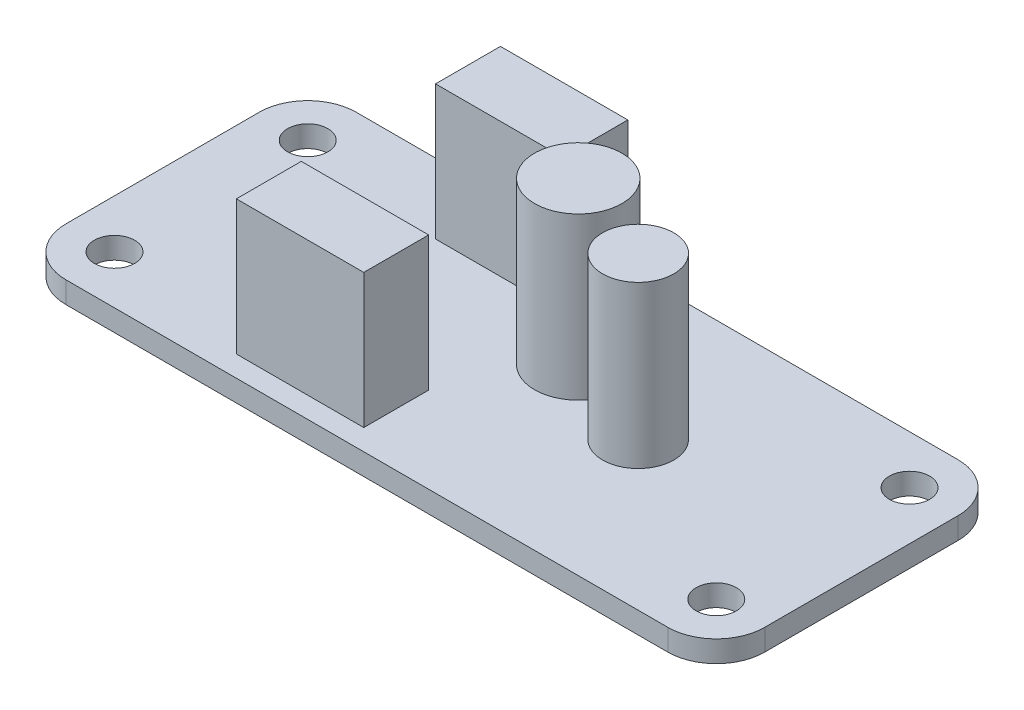
ISO-10303-21;
HEADER;
FILE_DESCRIPTION(('STEP AP214'),'2;1');
FILE_NAME('part.step','',(''),(''),'','','');
FILE_SCHEMA(('AUTOMOTIVE_DESIGN { 1 0 10303 214 1 1 1 1 }'));
ENDSEC;
DATA;
#1=APPLICATION_CONTEXT('core data for automotive mechanical design processes');
#2=APPLICATION_PROTOCOL_DEFINITION('international standard','automotive_design',2000,#1);
#3=PRODUCT_CONTEXT('',#1,'mechanical');
#4=PRODUCT('Part','Part','',(#3));
#5=PRODUCT_RELATED_PRODUCT_CATEGORY('part','',(#4));
#6=PRODUCT_DEFINITION_FORMATION('','',#4);
#7=PRODUCT_DEFINITION_CONTEXT('part definition',#1,'design');
#8=PRODUCT_DEFINITION('design','',#6,#7);
#9=PRODUCT_DEFINITION_SHAPE('','',#8);
#10=(LENGTH_UNIT() NAMED_UNIT(*) SI_UNIT(.MILLI.,.METRE.));
#11=(NAMED_UNIT(*) PLANE_ANGLE_UNIT() SI_UNIT($,.RADIAN.));
#12=(NAMED_UNIT(*) SI_UNIT($,.STERADIAN.) SOLID_ANGLE_UNIT());
#13=UNCERTAINTY_MEASURE_WITH_UNIT(LENGTH_MEASURE(1.E-05),#10,'distance_accuracy_value','');
#14=(GEOMETRIC_REPRESENTATION_CONTEXT(3) GLOBAL_UNCERTAINTY_ASSIGNED_CONTEXT((#13)) GLOBAL_UNIT_ASSIGNED_CONTEXT((#10,
#11,#12)) REPRESENTATION_CONTEXT('',''));
#15=CARTESIAN_POINT('',(0.,0.,0.));
#16=DIRECTION('',(0.,0.,1.));
#17=DIRECTION('',(1.,0.,0.));
#18=AXIS2_PLACEMENT_3D('',#15,#16,#17);
#19=CARTESIAN_POINT('',(48.39,1.6,-17.99));
#20=DIRECTION('',(0.,1.,0.));
#21=DIRECTION('',(0.,0.,1.));
#22=AXIS2_PLACEMENT_3D('',#19,#20,#21);
#23=PLANE('',#22);
#24=CARTESIAN_POINT('',(28.13,1.6,-13.6));
#25=DIRECTION('',(0.,1.,0.));
#26=DIRECTION('',(0.,0.,1.));
#27=AXIS2_PLACEMENT_3D('',#24,#25,#26);
#28=CIRCLE('',#27,3.25);
#29=CARTESIAN_POINT('',(28.13,1.6,-10.35));
#30=VERTEX_POINT('',#29);
#31=EDGE_CURVE('E440',#30,#30,#28,.T.);
#32=ORIENTED_EDGE('',*,*,#31,.F.);
#33=EDGE_LOOP('',(#32));
#34=FACE_BOUND('',#33,.T.);
#35=CARTESIAN_POINT('',(35.19,1.6,-11.));
#36=DIRECTION('',(0.,1.,0.));
#37=DIRECTION('',(0.,0.,1.));
#38=AXIS2_PLACEMENT_3D('',#35,#36,#37);
#39=CIRCLE('',#38,2.65);
#40=CARTESIAN_POINT('',(35.19,1.6,-8.35));
#41=VERTEX_POINT('',#40);
#42=EDGE_CURVE('E439',#41,#41,#39,.T.);
#43=ORIENTED_EDGE('',*,*,#42,.F.);
#44=EDGE_LOOP('',(#43));
#45=FACE_BOUND('',#44,.T.);
#46=DIRECTION('',(0.,0.,1.));
#47=VECTOR('',#46,1.);
#48=CARTESIAN_POINT('',(24.21,1.6,0.));
#49=LINE('',#48,#47);
#50=CARTESIAN_POINT('',(24.21,1.6,-21.21));
#51=VERTEX_POINT('',#50);
#52=CARTESIAN_POINT('',(24.21,1.6,-16.38));
#53=VERTEX_POINT('',#52);
#54=EDGE_CURVE('E156',#51,#53,#49,.T.);
#55=ORIENTED_EDGE('',*,*,#54,.T.);
#56=DIRECTION('',(1.,0.,0.));
#57=VECTOR('',#56,1.);
#58=CARTESIAN_POINT('',(0.,1.6,-16.38));
#59=LINE('',#58,#57);
#60=CARTESIAN_POINT('',(14.73,1.6,-16.38));
#61=VERTEX_POINT('',#60);
#62=EDGE_CURVE('E170',#61,#53,#59,.T.);
#63=ORIENTED_EDGE('',*,*,#62,.F.);
#64=DIRECTION('',(0.,0.,1.));
#65=VECTOR('',#64,1.);
#66=CARTESIAN_POINT('',(14.73,1.6,0.));
#67=LINE('',#66,#65);
#68=CARTESIAN_POINT('',(14.73,1.6,-21.21));
#69=VERTEX_POINT('',#68);
#70=EDGE_CURVE('E185',#69,#61,#67,.T.);
#71=ORIENTED_EDGE('',*,*,#70,.F.);
#72=DIRECTION('',(1.,0.,0.));
#73=VECTOR('',#72,1.);
#74=CARTESIAN_POINT('',(0.,1.6,-21.21));
#75=LINE('',#74,#73);
#76=EDGE_CURVE('E182',#69,#51,#75,.T.);
#77=ORIENTED_EDGE('',*,*,#76,.T.);
#78=EDGE_LOOP('',(#55,#63,#71,#77));
#79=FACE_BOUND('',#78,.T.);
#80=DIRECTION('',(0.,0.,1.));
#81=VECTOR('',#80,1.);
#82=CARTESIAN_POINT('',(24.21,1.6,0.));
#83=LINE('',#82,#81);
#84=CARTESIAN_POINT('',(24.21,1.6,-6.39));
#85=VERTEX_POINT('',#84);
#86=CARTESIAN_POINT('',(24.21,1.6,-1.56));
#87=VERTEX_POINT('',#86);
#88=EDGE_CURVE('E161',#85,#87,#83,.T.);
#89=ORIENTED_EDGE('',*,*,#88,.T.);
#90=DIRECTION('',(1.,0.,0.));
#91=VECTOR('',#90,1.);
#92=CARTESIAN_POINT('',(0.,1.6,-1.56));
#93=LINE('',#92,#91);
#94=CARTESIAN_POINT('',(14.73,1.6,-1.56));
#95=VERTEX_POINT('',#94);
#96=EDGE_CURVE('E195',#95,#87,#93,.T.);
#97=ORIENTED_EDGE('',*,*,#96,.F.);
#98=DIRECTION('',(0.,0.,1.));
#99=VECTOR('',#98,1.);
#100=CARTESIAN_POINT('',(14.73,1.6,0.));
#101=LINE('',#100,#99);
#102=CARTESIAN_POINT('',(14.73,1.6,-6.39));
#103=VERTEX_POINT('',#102);
#104=EDGE_CURVE('E208',#103,#95,#101,.T.);
#105=ORIENTED_EDGE('',*,*,#104,.F.);
#106=DIRECTION('',(1.,0.,0.));
#107=VECTOR('',#106,1.);
#108=CARTESIAN_POINT('',(0.,1.6,-6.39));
#109=LINE('',#108,#107);
#110=EDGE_CURVE('E205',#103,#85,#109,.T.);
#111=ORIENTED_EDGE('',*,*,#110,.T.);
#112=EDGE_LOOP('',(#89,#97,#105,#111));
#113=FACE_BOUND('',#112,.T.);
#114=CARTESIAN_POINT('',(48.39,1.6,-3.61));
#115=DIRECTION('',(0.,1.,0.));
#116=DIRECTION('',(0.,0.,1.));
#117=AXIS2_PLACEMENT_3D('',#114,#115,#116);
#118=CIRCLE('',#117,1.5);
#119=CARTESIAN_POINT('',(48.39,1.6,-2.11));
#120=VERTEX_POINT('',#119);
#121=EDGE_CURVE('E224',#120,#120,#118,.T.);
#122=ORIENTED_EDGE('',*,*,#121,.F.);
#123=EDGE_LOOP('',(#122));
#124=FACE_BOUND('',#123,.T.);
#125=CARTESIAN_POINT('',(3.61,1.6,-17.99));
#126=DIRECTION('',(0.,1.,0.));
#127=DIRECTION('',(0.,0.,1.));
#128=AXIS2_PLACEMENT_3D('',#125,#126,#127);
#129=CIRCLE('',#128,1.5);
#130=CARTESIAN_POINT('',(3.61,1.6,-16.49));
#131=VERTEX_POINT('',#130);
#132=EDGE_CURVE('E236',#131,#131,#129,.T.);
#133=ORIENTED_EDGE('',*,*,#132,.F.);
#134=EDGE_LOOP('',(#133));
#135=FACE_BOUND('',#134,.T.);
#136=CARTESIAN_POINT('',(48.39,1.6,-17.99));
#137=DIRECTION('',(0.,1.,0.));
#138=DIRECTION('',(0.,0.,1.));
#139=AXIS2_PLACEMENT_3D('',#136,#137,#138);
#140=CIRCLE('',#139,3.61);
#141=CARTESIAN_POINT('',(52.,1.6,-17.99));
#142=VERTEX_POINT('',#141);
#143=CARTESIAN_POINT('',(48.39,1.6,-21.6));
#144=VERTEX_POINT('',#143);
#145=EDGE_CURVE('E242',#142,#144,#140,.T.);
#146=ORIENTED_EDGE('',*,*,#145,.T.);
#147=DIRECTION('',(-1.,0.,0.));
#148=VECTOR('',#147,1.);
#149=CARTESIAN_POINT('',(48.39,1.6,-21.6));
#150=LINE('',#149,#148);
#151=CARTESIAN_POINT('',(3.61,1.6,-21.6));
#152=VERTEX_POINT('',#151);
#153=EDGE_CURVE('E245',#144,#152,#150,.T.);
#154=ORIENTED_EDGE('',*,*,#153,.T.);
#155=CARTESIAN_POINT('',(3.61,1.6,-17.99));
#156=DIRECTION('',(0.,1.,0.));
#157=DIRECTION('',(0.,0.,1.));
#158=AXIS2_PLACEMENT_3D('',#155,#156,#157);
#159=CIRCLE('',#158,3.61);
#160=CARTESIAN_POINT('',(0.,1.6,-17.99));
#161=VERTEX_POINT('',#160);
#162=EDGE_CURVE('E248',#152,#161,#159,.T.);
#163=ORIENTED_EDGE('',*,*,#162,.T.);
#164=DIRECTION('',(0.,0.,1.));
#165=VECTOR('',#164,1.);
#166=CARTESIAN_POINT('',(0.,1.6,-17.99));
#167=LINE('',#166,#165);
#168=CARTESIAN_POINT('',(0.,1.6,-3.61000000000002));
#169=VERTEX_POINT('',#168);
#170=EDGE_CURVE('E250',#161,#169,#167,.T.);
#171=ORIENTED_EDGE('',*,*,#170,.T.);
#172=CARTESIAN_POINT('',(3.61,1.6,-3.61));
#173=DIRECTION('',(0.,1.,0.));
#174=DIRECTION('',(0.,0.,-1.));
#175=AXIS2_PLACEMENT_3D('',#172,#173,#174);
#176=CIRCLE('',#175,3.61);
#177=CARTESIAN_POINT('',(3.61000000000003,1.6,0.));
#178=VERTEX_POINT('',#177);
#179=EDGE_CURVE('E252',#169,#178,#176,.T.);
#180=ORIENTED_EDGE('',*,*,#179,.T.);
#181=DIRECTION('',(1.,0.,0.));
#182=VECTOR('',#181,1.);
#183=CARTESIAN_POINT('',(3.61000000000003,1.6,0.));
#184=LINE('',#183,#182);
#185=CARTESIAN_POINT('',(48.39,1.6,0.));
#186=VERTEX_POINT('',#185);
#187=EDGE_CURVE('E254',#178,#186,#184,.T.);
#188=ORIENTED_EDGE('',*,*,#187,.T.);
#189=CARTESIAN_POINT('',(48.39,1.6,-3.61));
#190=DIRECTION('',(0.,1.,0.));
#191=DIRECTION('',(0.,0.,1.));
#192=AXIS2_PLACEMENT_3D('',#189,#190,#191);
#193=CIRCLE('',#192,3.61);
#194=CARTESIAN_POINT('',(52.,1.6,-3.61));
#195=VERTEX_POINT('',#194);
#196=EDGE_CURVE('E256',#186,#195,#193,.T.);
#197=ORIENTED_EDGE('',*,*,#196,.T.);
#198=DIRECTION('',(0.,0.,-1.));
#199=VECTOR('',#198,1.);
#200=CARTESIAN_POINT('',(52.,1.6,-3.61));
#201=LINE('',#200,#199);
#202=EDGE_CURVE('E258',#195,#142,#201,.T.);
#203=ORIENTED_EDGE('',*,*,#202,.T.);
#204=EDGE_LOOP('',(#146,#154,#163,#171,#180,#188,#197,#203));
#205=FACE_BOUND('',#204,.T.);
#206=CARTESIAN_POINT('',(48.39,1.6,-17.99));
#207=DIRECTION('',(0.,1.,0.));
#208=DIRECTION('',(0.,0.,1.));
#209=AXIS2_PLACEMENT_3D('',#206,#207,#208);
#210=CIRCLE('',#209,1.5);
#211=CARTESIAN_POINT('',(48.39,1.6,-16.49));
#212=VERTEX_POINT('',#211);
#213=EDGE_CURVE('E230',#212,#212,#210,.T.);
#214=ORIENTED_EDGE('',*,*,#213,.F.);
#215=EDGE_LOOP('',(#214));
#216=FACE_BOUND('',#215,.T.);
#217=CARTESIAN_POINT('',(3.61,1.6,-3.61));
#218=DIRECTION('',(0.,1.,0.));
#219=DIRECTION('',(0.,0.,1.));
#220=AXIS2_PLACEMENT_3D('',#217,#218,#219);
#221=CIRCLE('',#220,1.5);
#222=CARTESIAN_POINT('',(3.61,1.6,-2.11));
#223=VERTEX_POINT('',#222);
#224=EDGE_CURVE('E218',#223,#223,#221,.T.);
#225=ORIENTED_EDGE('',*,*,#224,.F.);
#226=EDGE_LOOP('',(#225));
#227=FACE_BOUND('',#226,.T.);
#228=ADVANCED_FACE('F34',(#34,#45,#79,#113,#124,#135,#205,#216,#227),#23,.T.);
#229=CARTESIAN_POINT('',(48.39,0.,-17.99));
#230=DIRECTION('',(0.,1.,0.));
#231=DIRECTION('',(0.,0.,1.));
#232=AXIS2_PLACEMENT_3D('',#229,#230,#231);
#233=PLANE('',#232);
#234=CARTESIAN_POINT('',(48.39,0.,-17.99));
#235=DIRECTION('',(0.,1.,0.));
#236=DIRECTION('',(0.,0.,1.));
#237=AXIS2_PLACEMENT_3D('',#234,#235,#236);
#238=CIRCLE('',#237,3.61);
#239=CARTESIAN_POINT('',(52.,0.,-17.99));
#240=VERTEX_POINT('',#239);
#241=CARTESIAN_POINT('',(48.39,0.,-21.6));
#242=VERTEX_POINT('',#241);
#243=EDGE_CURVE('E239',#240,#242,#238,.T.);
#244=ORIENTED_EDGE('',*,*,#243,.F.);
#245=DIRECTION('',(0.,0.,-1.));
#246=VECTOR('',#245,1.);
#247=CARTESIAN_POINT('',(52.,0.,-3.61));
#248=LINE('',#247,#246);
#249=CARTESIAN_POINT('',(52.,0.,-3.61));
#250=VERTEX_POINT('',#249);
#251=EDGE_CURVE('E246',#250,#240,#248,.T.);
#252=ORIENTED_EDGE('',*,*,#251,.F.);
#253=CARTESIAN_POINT('',(48.39,0.,-3.61));
#254=DIRECTION('',(0.,1.,0.));
#255=DIRECTION('',(0.,0.,1.));
#256=AXIS2_PLACEMENT_3D('',#253,#254,#255);
#257=CIRCLE('',#256,3.61);
#258=CARTESIAN_POINT('',(48.39,0.,0.));
#259=VERTEX_POINT('',#258);
#260=EDGE_CURVE('E273',#259,#250,#257,.T.);
#261=ORIENTED_EDGE('',*,*,#260,.F.);
#262=DIRECTION('',(1.,0.,0.));
#263=VECTOR('',#262,1.);
#264=CARTESIAN_POINT('',(3.61000000000003,0.,0.));
#265=LINE('',#264,#263);
#266=CARTESIAN_POINT('',(3.61000000000003,0.,0.));
#267=VERTEX_POINT('',#266);
#268=EDGE_CURVE('E271',#267,#259,#265,.T.);
#269=ORIENTED_EDGE('',*,*,#268,.F.);
#270=CARTESIAN_POINT('',(3.61,0.,-3.61));
#271=DIRECTION('',(0.,1.,0.));
#272=DIRECTION('',(0.,0.,-1.));
#273=AXIS2_PLACEMENT_3D('',#270,#271,#272);
#274=CIRCLE('',#273,3.61);
#275=CARTESIAN_POINT('',(0.,0.,-3.61000000000002));
#276=VERTEX_POINT('',#275);
#277=EDGE_CURVE('E269',#276,#267,#274,.T.);
#278=ORIENTED_EDGE('',*,*,#277,.F.);
#279=DIRECTION('',(0.,0.,1.));
#280=VECTOR('',#279,1.);
#281=CARTESIAN_POINT('',(0.,0.,-17.99));
#282=LINE('',#281,#280);
#283=CARTESIAN_POINT('',(0.,0.,-17.99));
#284=VERTEX_POINT('',#283);
#285=EDGE_CURVE('E267',#284,#276,#282,.T.);
#286=ORIENTED_EDGE('',*,*,#285,.F.);
#287=CARTESIAN_POINT('',(3.61,0.,-17.99));
#288=DIRECTION('',(0.,1.,0.));
#289=DIRECTION('',(0.,0.,1.));
#290=AXIS2_PLACEMENT_3D('',#287,#288,#289);
#291=CIRCLE('',#290,3.61);
#292=CARTESIAN_POINT('',(3.61,0.,-21.6));
#293=VERTEX_POINT('',#292);
#294=EDGE_CURVE('E265',#293,#284,#291,.T.);
#295=ORIENTED_EDGE('',*,*,#294,.F.);
#296=DIRECTION('',(-1.,0.,0.));
#297=VECTOR('',#296,1.);
#298=CARTESIAN_POINT('',(48.39,0.,-21.6));
#299=LINE('',#298,#297);
#300=EDGE_CURVE('E263',#242,#293,#299,.T.);
#301=ORIENTED_EDGE('',*,*,#300,.F.);
#302=EDGE_LOOP('',(#244,#252,#261,#269,#278,#286,#295,#301));
#303=FACE_BOUND('',#302,.T.);
#304=CARTESIAN_POINT('',(3.61,0.,-17.99));
#305=DIRECTION('',(0.,1.,0.));
#306=DIRECTION('',(0.,0.,1.));
#307=AXIS2_PLACEMENT_3D('',#304,#305,#306);
#308=CIRCLE('',#307,1.5);
#309=CARTESIAN_POINT('',(3.61,0.,-16.49));
#310=VERTEX_POINT('',#309);
#311=EDGE_CURVE('E233',#310,#310,#308,.T.);
#312=ORIENTED_EDGE('',*,*,#311,.T.);
#313=EDGE_LOOP('',(#312));
#314=FACE_BOUND('',#313,.T.);
#315=CARTESIAN_POINT('',(48.39,0.,-17.99));
#316=DIRECTION('',(0.,1.,0.));
#317=DIRECTION('',(0.,0.,1.));
#318=AXIS2_PLACEMENT_3D('',#315,#316,#317);
#319=CIRCLE('',#318,1.5);
#320=CARTESIAN_POINT('',(48.39,0.,-16.49));
#321=VERTEX_POINT('',#320);
#322=EDGE_CURVE('E227',#321,#321,#319,.T.);
#323=ORIENTED_EDGE('',*,*,#322,.T.);
#324=EDGE_LOOP('',(#323));
#325=FACE_BOUND('',#324,.T.);
#326=CARTESIAN_POINT('',(48.39,0.,-3.61));
#327=DIRECTION('',(0.,1.,0.));
#328=DIRECTION('',(0.,0.,1.));
#329=AXIS2_PLACEMENT_3D('',#326,#327,#328);
#330=CIRCLE('',#329,1.5);
#331=CARTESIAN_POINT('',(48.39,0.,-2.11));
#332=VERTEX_POINT('',#331);
#333=EDGE_CURVE('E221',#332,#332,#330,.T.);
#334=ORIENTED_EDGE('',*,*,#333,.T.);
#335=EDGE_LOOP('',(#334));
#336=FACE_BOUND('',#335,.T.);
#337=CARTESIAN_POINT('',(3.61,0.,-3.61));
#338=DIRECTION('',(0.,1.,0.));
#339=DIRECTION('',(0.,0.,1.));
#340=AXIS2_PLACEMENT_3D('',#337,#338,#339);
#341=CIRCLE('',#340,1.5);
#342=CARTESIAN_POINT('',(3.61,0.,-2.11));
#343=VERTEX_POINT('',#342);
#344=EDGE_CURVE('E217',#343,#343,#341,.T.);
#345=ORIENTED_EDGE('',*,*,#344,.T.);
#346=EDGE_LOOP('',(#345));
#347=FACE_BOUND('',#346,.T.);
#348=ADVANCED_FACE('F303',(#303,#314,#325,#336,#347),#233,.F.);
#349=CARTESIAN_POINT('',(48.39,1.6,-17.99));
#350=DIRECTION('',(0.,-1.,0.));
#351=DIRECTION('',(0.,0.,-1.));
#352=AXIS2_PLACEMENT_3D('',#349,#350,#351);
#353=CYLINDRICAL_SURFACE('',#352,3.61);
#354=ORIENTED_EDGE('',*,*,#243,.T.);
#355=DIRECTION('',(0.,-1.,0.));
#356=VECTOR('',#355,1.);
#357=CARTESIAN_POINT('',(48.39,1.6,-21.6));
#358=LINE('',#357,#356);
#359=EDGE_CURVE('E11',#144,#242,#358,.T.);
#360=ORIENTED_EDGE('',*,*,#359,.F.);
#361=ORIENTED_EDGE('',*,*,#145,.F.);
#362=DIRECTION('',(0.,-1.,0.));
#363=VECTOR('',#362,1.);
#364=CARTESIAN_POINT('',(52.,1.6,-17.99));
#365=LINE('',#364,#363);
#366=EDGE_CURVE('E260',#142,#240,#365,.T.);
#367=ORIENTED_EDGE('',*,*,#366,.T.);
#368=EDGE_LOOP('',(#354,#360,#361,#367));
#369=FACE_BOUND('',#368,.T.);
#370=ADVANCED_FACE('F36',(#369),#353,.T.);
#371=CARTESIAN_POINT('',(48.39,1.6,-21.6));
#372=DIRECTION('',(0.,0.,1.));
#373=DIRECTION('',(1.,0.,0.));
#374=AXIS2_PLACEMENT_3D('',#371,#372,#373);
#375=PLANE('',#374);
#376=ORIENTED_EDGE('',*,*,#300,.T.);
#377=DIRECTION('',(0.,-1.,0.));
#378=VECTOR('',#377,1.);
#379=CARTESIAN_POINT('',(3.61,1.6,-21.6));
#380=LINE('',#379,#378);
#381=EDGE_CURVE('E42',#152,#293,#380,.T.);
#382=ORIENTED_EDGE('',*,*,#381,.F.);
#383=ORIENTED_EDGE('',*,*,#153,.F.);
#384=ORIENTED_EDGE('',*,*,#359,.T.);
#385=EDGE_LOOP('',(#376,#382,#383,#384));
#386=FACE_BOUND('',#385,.T.);
#387=ADVANCED_FACE('F321',(#386),#375,.F.);
#388=CARTESIAN_POINT('',(3.61,1.6,-17.99));
#389=DIRECTION('',(0.,-1.,0.));
#390=DIRECTION('',(0.,0.,-1.));
#391=AXIS2_PLACEMENT_3D('',#388,#389,#390);
#392=CYLINDRICAL_SURFACE('',#391,3.61);
#393=ORIENTED_EDGE('',*,*,#294,.T.);
#394=DIRECTION('',(0.,-1.,0.));
#395=VECTOR('',#394,1.);
#396=CARTESIAN_POINT('',(0.,1.6,-17.99));
#397=LINE('',#396,#395);
#398=EDGE_CURVE('E290',#161,#284,#397,.T.);
#399=ORIENTED_EDGE('',*,*,#398,.F.);
#400=ORIENTED_EDGE('',*,*,#162,.F.);
#401=ORIENTED_EDGE('',*,*,#381,.T.);
#402=EDGE_LOOP('',(#393,#399,#400,#401));
#403=FACE_BOUND('',#402,.T.);
#404=ADVANCED_FACE('F297',(#403),#392,.T.);
#405=CARTESIAN_POINT('',(0.,1.6,-17.99));
#406=DIRECTION('',(1.,0.,0.));
#407=DIRECTION('',(0.,0.,-1.));
#408=AXIS2_PLACEMENT_3D('',#405,#406,#407);
#409=PLANE('',#408);
#410=ORIENTED_EDGE('',*,*,#285,.T.);
#411=DIRECTION('',(0.,-1.,0.));
#412=VECTOR('',#411,1.);
#413=CARTESIAN_POINT('',(0.,1.6,-3.61000000000002));
#414=LINE('',#413,#412);
#415=EDGE_CURVE('E287',#169,#276,#414,.T.);
#416=ORIENTED_EDGE('',*,*,#415,.F.);
#417=ORIENTED_EDGE('',*,*,#170,.F.);
#418=ORIENTED_EDGE('',*,*,#398,.T.);
#419=EDGE_LOOP('',(#410,#416,#417,#418));
#420=FACE_BOUND('',#419,.T.);
#421=ADVANCED_FACE('F309',(#420),#409,.F.);
#422=CARTESIAN_POINT('',(3.61,1.6,-3.61));
#423=DIRECTION('',(0.,-1.,0.));
#424=DIRECTION('',(0.,0.,-1.));
#425=AXIS2_PLACEMENT_3D('',#422,#423,#424);
#426=CYLINDRICAL_SURFACE('',#425,3.61);
#427=ORIENTED_EDGE('',*,*,#277,.T.);
#428=DIRECTION('',(0.,-1.,0.));
#429=VECTOR('',#428,1.);
#430=CARTESIAN_POINT('',(3.61000000000003,1.6,0.));
#431=LINE('',#430,#429);
#432=EDGE_CURVE('E284',#178,#267,#431,.T.);
#433=ORIENTED_EDGE('',*,*,#432,.F.);
#434=ORIENTED_EDGE('',*,*,#179,.F.);
#435=ORIENTED_EDGE('',*,*,#415,.T.);
#436=EDGE_LOOP('',(#427,#433,#434,#435));
#437=FACE_BOUND('',#436,.T.);
#438=ADVANCED_FACE('F313',(#437),#426,.T.);
#439=CARTESIAN_POINT('',(3.61000000000003,1.6,0.));
#440=DIRECTION('',(0.,0.,-1.));
#441=DIRECTION('',(-1.,0.,0.));
#442=AXIS2_PLACEMENT_3D('',#439,#440,#441);
#443=PLANE('',#442);
#444=ORIENTED_EDGE('',*,*,#268,.T.);
#445=DIRECTION('',(0.,-1.,0.));
#446=VECTOR('',#445,1.);
#447=CARTESIAN_POINT('',(48.39,1.6,0.));
#448=LINE('',#447,#446);
#449=EDGE_CURVE('E281',#186,#259,#448,.T.);
#450=ORIENTED_EDGE('',*,*,#449,.F.);
#451=ORIENTED_EDGE('',*,*,#187,.F.);
#452=ORIENTED_EDGE('',*,*,#432,.T.);
#453=EDGE_LOOP('',(#444,#450,#451,#452));
#454=FACE_BOUND('',#453,.T.);
#455=ADVANCED_FACE('F334',(#454),#443,.F.);
#456=CARTESIAN_POINT('',(48.39,1.6,-3.61));
#457=DIRECTION('',(0.,-1.,0.));
#458=DIRECTION('',(0.,0.,-1.));
#459=AXIS2_PLACEMENT_3D('',#456,#457,#458);
#460=CYLINDRICAL_SURFACE('',#459,3.61);
#461=ORIENTED_EDGE('',*,*,#260,.T.);
#462=DIRECTION('',(0.,-1.,0.));
#463=VECTOR('',#462,1.);
#464=CARTESIAN_POINT('',(52.,1.6,-3.61));
#465=LINE('',#464,#463);
#466=EDGE_CURVE('E278',#195,#250,#465,.T.);
#467=ORIENTED_EDGE('',*,*,#466,.F.);
#468=ORIENTED_EDGE('',*,*,#196,.F.);
#469=ORIENTED_EDGE('',*,*,#449,.T.);
#470=EDGE_LOOP('',(#461,#467,#468,#469));
#471=FACE_BOUND('',#470,.T.);
#472=ADVANCED_FACE('F332',(#471),#460,.T.);
#473=CARTESIAN_POINT('',(52.,1.6,-3.61));
#474=DIRECTION('',(-1.,0.,0.));
#475=DIRECTION('',(0.,0.,1.));
#476=AXIS2_PLACEMENT_3D('',#473,#474,#475);
#477=PLANE('',#476);
#478=ORIENTED_EDGE('',*,*,#251,.T.);
#479=ORIENTED_EDGE('',*,*,#366,.F.);
#480=ORIENTED_EDGE('',*,*,#202,.F.);
#481=ORIENTED_EDGE('',*,*,#466,.T.);
#482=EDGE_LOOP('',(#478,#479,#480,#481));
#483=FACE_BOUND('',#482,.T.);
#484=ADVANCED_FACE('F327',(#483),#477,.F.);
#485=CARTESIAN_POINT('',(3.61,1.6,-17.99));
#486=DIRECTION('',(0.,-1.,0.));
#487=DIRECTION('',(0.,0.,-1.));
#488=AXIS2_PLACEMENT_3D('',#485,#486,#487);
#489=CYLINDRICAL_SURFACE('',#488,1.5);
#490=ORIENTED_EDGE('',*,*,#132,.T.);
#491=EDGE_LOOP('',(#490));
#492=FACE_BOUND('',#491,.T.);
#493=ORIENTED_EDGE('',*,*,#311,.F.);
#494=EDGE_LOOP('',(#493));
#495=FACE_BOUND('',#494,.T.);
#496=ADVANCED_FACE('F353',(#492,#495),#489,.F.);
#497=CARTESIAN_POINT('',(48.39,1.6,-17.99));
#498=DIRECTION('',(0.,-1.,0.));
#499=DIRECTION('',(0.,0.,-1.));
#500=AXIS2_PLACEMENT_3D('',#497,#498,#499);
#501=CYLINDRICAL_SURFACE('',#500,1.5);
#502=ORIENTED_EDGE('',*,*,#213,.T.);
#503=EDGE_LOOP('',(#502));
#504=FACE_BOUND('',#503,.T.);
#505=ORIENTED_EDGE('',*,*,#322,.F.);
#506=EDGE_LOOP('',(#505));
#507=FACE_BOUND('',#506,.T.);
#508=ADVANCED_FACE('F360',(#504,#507),#501,.F.);
#509=CARTESIAN_POINT('',(48.39,1.6,-3.61));
#510=DIRECTION('',(0.,-1.,0.));
#511=DIRECTION('',(0.,0.,-1.));
#512=AXIS2_PLACEMENT_3D('',#509,#510,#511);
#513=CYLINDRICAL_SURFACE('',#512,1.5);
#514=ORIENTED_EDGE('',*,*,#121,.T.);
#515=EDGE_LOOP('',(#514));
#516=FACE_BOUND('',#515,.T.);
#517=ORIENTED_EDGE('',*,*,#333,.F.);
#518=EDGE_LOOP('',(#517));
#519=FACE_BOUND('',#518,.T.);
#520=ADVANCED_FACE('F365',(#516,#519),#513,.F.);
#521=CARTESIAN_POINT('',(3.61,1.6,-3.61));
#522=DIRECTION('',(0.,-1.,0.));
#523=DIRECTION('',(0.,0.,-1.));
#524=AXIS2_PLACEMENT_3D('',#521,#522,#523);
#525=CYLINDRICAL_SURFACE('',#524,1.5);
#526=ORIENTED_EDGE('',*,*,#224,.T.);
#527=EDGE_LOOP('',(#526));
#528=FACE_BOUND('',#527,.T.);
#529=ORIENTED_EDGE('',*,*,#344,.F.);
#530=EDGE_LOOP('',(#529));
#531=FACE_BOUND('',#530,.T.);
#532=ADVANCED_FACE('F377',(#528,#531),#525,.F.);
#533=CARTESIAN_POINT('',(24.21,11.6,0.));
#534=DIRECTION('',(1.,0.,0.));
#535=DIRECTION('',(0.,0.,-1.));
#536=AXIS2_PLACEMENT_3D('',#533,#534,#535);
#537=PLANE('',#536);
#538=ORIENTED_EDGE('',*,*,#88,.F.);
#539=DIRECTION('',(0.,-1.,0.));
#540=VECTOR('',#539,1.);
#541=CARTESIAN_POINT('',(24.21,11.6,-6.39));
#542=LINE('',#541,#540);
#543=CARTESIAN_POINT('',(24.21,11.6,-6.39));
#544=VERTEX_POINT('',#543);
#545=EDGE_CURVE('E215',#544,#85,#542,.T.);
#546=ORIENTED_EDGE('',*,*,#545,.F.);
#547=DIRECTION('',(0.,0.,1.));
#548=VECTOR('',#547,1.);
#549=CARTESIAN_POINT('',(24.21,11.6,0.));
#550=LINE('',#549,#548);
#551=CARTESIAN_POINT('',(24.21,11.6,-1.56));
#552=VERTEX_POINT('',#551);
#553=EDGE_CURVE('E191',#544,#552,#550,.T.);
#554=ORIENTED_EDGE('',*,*,#553,.T.);
#555=DIRECTION('',(0.,-1.,0.));
#556=VECTOR('',#555,1.);
#557=CARTESIAN_POINT('',(24.21,11.6,-1.56));
#558=LINE('',#557,#556);
#559=EDGE_CURVE('E202',#552,#87,#558,.T.);
#560=ORIENTED_EDGE('',*,*,#559,.T.);
#561=EDGE_LOOP('',(#538,#546,#554,#560));
#562=FACE_BOUND('',#561,.T.);
#563=ADVANCED_FACE('F379',(#562),#537,.T.);
#564=CARTESIAN_POINT('',(0.,11.6,-6.39));
#565=DIRECTION('',(0.,0.,-1.));
#566=DIRECTION('',(-1.,0.,0.));
#567=AXIS2_PLACEMENT_3D('',#564,#565,#566);
#568=PLANE('',#567);
#569=ORIENTED_EDGE('',*,*,#110,.F.);
#570=DIRECTION('',(0.,-1.,0.));
#571=VECTOR('',#570,1.);
#572=CARTESIAN_POINT('',(14.73,11.6,-6.39));
#573=LINE('',#572,#571);
#574=CARTESIAN_POINT('',(14.73,11.6,-6.39));
#575=VERTEX_POINT('',#574);
#576=EDGE_CURVE('E213',#575,#103,#573,.T.);
#577=ORIENTED_EDGE('',*,*,#576,.F.);
#578=DIRECTION('',(1.,0.,0.));
#579=VECTOR('',#578,1.);
#580=CARTESIAN_POINT('',(0.,11.6,-6.39));
#581=LINE('',#580,#579);
#582=EDGE_CURVE('E194',#575,#544,#581,.T.);
#583=ORIENTED_EDGE('',*,*,#582,.T.);
#584=ORIENTED_EDGE('',*,*,#545,.T.);
#585=EDGE_LOOP('',(#569,#577,#583,#584));
#586=FACE_BOUND('',#585,.T.);
#587=ADVANCED_FACE('F386',(#586),#568,.T.);
#588=CARTESIAN_POINT('',(14.73,11.6,0.));
#589=DIRECTION('',(1.,0.,0.));
#590=DIRECTION('',(0.,0.,-1.));
#591=AXIS2_PLACEMENT_3D('',#588,#589,#590);
#592=PLANE('',#591);
#593=ORIENTED_EDGE('',*,*,#104,.T.);
#594=DIRECTION('',(0.,-1.,0.));
#595=VECTOR('',#594,1.);
#596=CARTESIAN_POINT('',(14.73,11.6,-1.56));
#597=LINE('',#596,#595);
#598=CARTESIAN_POINT('',(14.73,11.6,-1.56));
#599=VERTEX_POINT('',#598);
#600=EDGE_CURVE('E57',#599,#95,#597,.T.);
#601=ORIENTED_EDGE('',*,*,#600,.F.);
#602=DIRECTION('',(0.,0.,1.));
#603=VECTOR('',#602,1.);
#604=CARTESIAN_POINT('',(14.73,11.6,0.));
#605=LINE('',#604,#603);
#606=EDGE_CURVE('E198',#575,#599,#605,.T.);
#607=ORIENTED_EDGE('',*,*,#606,.F.);
#608=ORIENTED_EDGE('',*,*,#576,.T.);
#609=EDGE_LOOP('',(#593,#601,#607,#608));
#610=FACE_BOUND('',#609,.T.);
#611=ADVANCED_FACE('F394',(#610),#592,.F.);
#612=CARTESIAN_POINT('',(0.,11.6,-1.56));
#613=DIRECTION('',(0.,0.,-1.));
#614=DIRECTION('',(-1.,0.,0.));
#615=AXIS2_PLACEMENT_3D('',#612,#613,#614);
#616=PLANE('',#615);
#617=ORIENTED_EDGE('',*,*,#96,.T.);
#618=ORIENTED_EDGE('',*,*,#559,.F.);
#619=DIRECTION('',(1.,0.,0.));
#620=VECTOR('',#619,1.);
#621=CARTESIAN_POINT('',(0.,11.6,-1.56));
#622=LINE('',#621,#620);
#623=EDGE_CURVE('E200',#599,#552,#622,.T.);
#624=ORIENTED_EDGE('',*,*,#623,.F.);
#625=ORIENTED_EDGE('',*,*,#600,.T.);
#626=EDGE_LOOP('',(#617,#618,#624,#625));
#627=FACE_BOUND('',#626,.T.);
#628=ADVANCED_FACE('F398',(#627),#616,.F.);
#629=CARTESIAN_POINT('',(0.,11.6,0.));
#630=DIRECTION('',(0.,1.,0.));
#631=DIRECTION('',(0.,0.,1.));
#632=AXIS2_PLACEMENT_3D('',#629,#630,#631);
#633=PLANE('',#632);
#634=ORIENTED_EDGE('',*,*,#553,.F.);
#635=ORIENTED_EDGE('',*,*,#582,.F.);
#636=ORIENTED_EDGE('',*,*,#606,.T.);
#637=ORIENTED_EDGE('',*,*,#623,.T.);
#638=EDGE_LOOP('',(#634,#635,#636,#637));
#639=FACE_BOUND('',#638,.T.);
#640=ADVANCED_FACE('F402',(#639),#633,.T.);
#641=CARTESIAN_POINT('',(24.21,11.6,0.));
#642=DIRECTION('',(1.,0.,0.));
#643=DIRECTION('',(0.,0.,-1.));
#644=AXIS2_PLACEMENT_3D('',#641,#642,#643);
#645=PLANE('',#644);
#646=ORIENTED_EDGE('',*,*,#54,.F.);
#647=DIRECTION('',(0.,-1.,0.));
#648=VECTOR('',#647,1.);
#649=CARTESIAN_POINT('',(24.21,11.6,-21.21));
#650=LINE('',#649,#648);
#651=CARTESIAN_POINT('',(24.21,11.6,-21.21));
#652=VERTEX_POINT('',#651);
#653=EDGE_CURVE('E151',#652,#51,#650,.T.);
#654=ORIENTED_EDGE('',*,*,#653,.F.);
#655=DIRECTION('',(0.,0.,1.));
#656=VECTOR('',#655,1.);
#657=CARTESIAN_POINT('',(24.21,11.6,0.));
#658=LINE('',#657,#656);
#659=CARTESIAN_POINT('',(24.21,11.6,-16.38));
#660=VERTEX_POINT('',#659);
#661=EDGE_CURVE('E154',#652,#660,#658,.T.);
#662=ORIENTED_EDGE('',*,*,#661,.T.);
#663=DIRECTION('',(0.,-1.,0.));
#664=VECTOR('',#663,1.);
#665=CARTESIAN_POINT('',(24.21,11.6,-16.38));
#666=LINE('',#665,#664);
#667=EDGE_CURVE('E180',#660,#53,#666,.T.);
#668=ORIENTED_EDGE('',*,*,#667,.T.);
#669=EDGE_LOOP('',(#646,#654,#662,#668));
#670=FACE_BOUND('',#669,.T.);
#671=ADVANCED_FACE('F153',(#670),#645,.T.);
#672=CARTESIAN_POINT('',(0.,11.6,-21.21));
#673=DIRECTION('',(0.,0.,-1.));
#674=DIRECTION('',(-1.,0.,0.));
#675=AXIS2_PLACEMENT_3D('',#672,#673,#674);
#676=PLANE('',#675);
#677=ORIENTED_EDGE('',*,*,#76,.F.);
#678=DIRECTION('',(0.,-1.,0.));
#679=VECTOR('',#678,1.);
#680=CARTESIAN_POINT('',(14.73,11.6,-21.21));
#681=LINE('',#680,#679);
#682=CARTESIAN_POINT('',(14.73,11.6,-21.21));
#683=VERTEX_POINT('',#682);
#684=EDGE_CURVE('E162',#683,#69,#681,.T.);
#685=ORIENTED_EDGE('',*,*,#684,.F.);
#686=DIRECTION('',(1.,0.,0.));
#687=VECTOR('',#686,1.);
#688=CARTESIAN_POINT('',(0.,11.6,-21.21));
#689=LINE('',#688,#687);
#690=EDGE_CURVE('E167',#683,#652,#689,.T.);
#691=ORIENTED_EDGE('',*,*,#690,.T.);
#692=ORIENTED_EDGE('',*,*,#653,.T.);
#693=EDGE_LOOP('',(#677,#685,#691,#692));
#694=FACE_BOUND('',#693,.T.);
#695=ADVANCED_FACE('F172',(#694),#676,.T.);
#696=CARTESIAN_POINT('',(14.73,11.6,0.));
#697=DIRECTION('',(1.,0.,0.));
#698=DIRECTION('',(0.,0.,-1.));
#699=AXIS2_PLACEMENT_3D('',#696,#697,#698);
#700=PLANE('',#699);
#701=ORIENTED_EDGE('',*,*,#70,.T.);
#702=DIRECTION('',(0.,-1.,0.));
#703=VECTOR('',#702,1.);
#704=CARTESIAN_POINT('',(14.73,11.6,-16.38));
#705=LINE('',#704,#703);
#706=CARTESIAN_POINT('',(14.73,11.6,-16.38));
#707=VERTEX_POINT('',#706);
#708=EDGE_CURVE('E49',#707,#61,#705,.T.);
#709=ORIENTED_EDGE('',*,*,#708,.F.);
#710=DIRECTION('',(0.,0.,1.));
#711=VECTOR('',#710,1.);
#712=CARTESIAN_POINT('',(14.73,11.6,0.));
#713=LINE('',#712,#711);
#714=EDGE_CURVE('E174',#683,#707,#713,.T.);
#715=ORIENTED_EDGE('',*,*,#714,.F.);
#716=ORIENTED_EDGE('',*,*,#684,.T.);
#717=EDGE_LOOP('',(#701,#709,#715,#716));
#718=FACE_BOUND('',#717,.T.);
#719=ADVANCED_FACE('F410',(#718),#700,.F.);
#720=CARTESIAN_POINT('',(0.,11.6,-16.38));
#721=DIRECTION('',(0.,0.,-1.));
#722=DIRECTION('',(-1.,0.,0.));
#723=AXIS2_PLACEMENT_3D('',#720,#721,#722);
#724=PLANE('',#723);
#725=ORIENTED_EDGE('',*,*,#62,.T.);
#726=ORIENTED_EDGE('',*,*,#667,.F.);
#727=DIRECTION('',(1.,0.,0.));
#728=VECTOR('',#727,1.);
#729=CARTESIAN_POINT('',(0.,11.6,-16.38));
#730=LINE('',#729,#728);
#731=EDGE_CURVE('E168',#707,#660,#730,.T.);
#732=ORIENTED_EDGE('',*,*,#731,.F.);
#733=ORIENTED_EDGE('',*,*,#708,.T.);
#734=EDGE_LOOP('',(#725,#726,#732,#733));
#735=FACE_BOUND('',#734,.T.);
#736=ADVANCED_FACE('F413',(#735),#724,.F.);
#737=CARTESIAN_POINT('',(0.,11.6,0.));
#738=DIRECTION('',(0.,1.,0.));
#739=DIRECTION('',(0.,0.,1.));
#740=AXIS2_PLACEMENT_3D('',#737,#738,#739);
#741=PLANE('',#740);
#742=ORIENTED_EDGE('',*,*,#661,.F.);
#743=ORIENTED_EDGE('',*,*,#690,.F.);
#744=ORIENTED_EDGE('',*,*,#714,.T.);
#745=ORIENTED_EDGE('',*,*,#731,.T.);
#746=EDGE_LOOP('',(#742,#743,#744,#745));
#747=FACE_BOUND('',#746,.T.);
#748=ADVANCED_FACE('F166',(#747),#741,.T.);
#749=CARTESIAN_POINT('',(35.19,13.6,-11.));
#750=DIRECTION('',(0.,-1.,0.));
#751=DIRECTION('',(0.,0.,-1.));
#752=AXIS2_PLACEMENT_3D('',#749,#750,#751);
#753=CYLINDRICAL_SURFACE('',#752,2.65);
#754=CARTESIAN_POINT('',(35.19,13.6,-11.));
#755=DIRECTION('',(0.,1.,0.));
#756=DIRECTION('',(0.,0.,1.));
#757=AXIS2_PLACEMENT_3D('',#754,#755,#756);
#758=CIRCLE('',#757,2.65);
#759=CARTESIAN_POINT('',(35.19,13.6,-8.35));
#760=VERTEX_POINT('',#759);
#761=EDGE_CURVE('E183',#760,#760,#758,.T.);
#762=ORIENTED_EDGE('',*,*,#761,.F.);
#763=EDGE_LOOP('',(#762));
#764=FACE_BOUND('',#763,.T.);
#765=ORIENTED_EDGE('',*,*,#42,.T.);
#766=EDGE_LOOP('',(#765));
#767=FACE_BOUND('',#766,.T.);
#768=ADVANCED_FACE('F419',(#764,#767),#753,.T.);
#769=CARTESIAN_POINT('',(35.19,13.6,-11.));
#770=DIRECTION('',(0.,1.,0.));
#771=DIRECTION('',(0.,0.,1.));
#772=AXIS2_PLACEMENT_3D('',#769,#770,#771);
#773=PLANE('',#772);
#774=ORIENTED_EDGE('',*,*,#761,.T.);
#775=EDGE_LOOP('',(#774));
#776=FACE_BOUND('',#775,.T.);
#777=ADVANCED_FACE('F422',(#776),#773,.T.);
#778=CARTESIAN_POINT('',(28.13,13.6,-13.6));
#779=DIRECTION('',(0.,-1.,0.));
#780=DIRECTION('',(0.,0.,-1.));
#781=AXIS2_PLACEMENT_3D('',#778,#779,#780);
#782=CYLINDRICAL_SURFACE('',#781,3.25);
#783=CARTESIAN_POINT('',(28.13,13.6,-13.6));
#784=DIRECTION('',(0.,1.,0.));
#785=DIRECTION('',(0.,0.,1.));
#786=AXIS2_PLACEMENT_3D('',#783,#784,#785);
#787=CIRCLE('',#786,3.25);
#788=CARTESIAN_POINT('',(28.13,13.6,-10.35));
#789=VERTEX_POINT('',#788);
#790=EDGE_CURVE('E438',#789,#789,#787,.T.);
#791=ORIENTED_EDGE('',*,*,#790,.F.);
#792=EDGE_LOOP('',(#791));
#793=FACE_BOUND('',#792,.T.);
#794=ORIENTED_EDGE('',*,*,#31,.T.);
#795=EDGE_LOOP('',(#794));
#796=FACE_BOUND('',#795,.T.);
#797=ADVANCED_FACE('F426',(#793,#796),#782,.T.);
#798=CARTESIAN_POINT('',(28.13,13.6,-13.6));
#799=DIRECTION('',(0.,1.,0.));
#800=DIRECTION('',(0.,0.,1.));
#801=AXIS2_PLACEMENT_3D('',#798,#799,#800);
#802=PLANE('',#801);
#803=ORIENTED_EDGE('',*,*,#790,.T.);
#804=EDGE_LOOP('',(#803));
#805=FACE_BOUND('',#804,.T.);
#806=ADVANCED_FACE('F430',(#805),#802,.T.);
#807=CLOSED_SHELL('',(#228,#348,#370,#387,#404,#421,#438,#455,#472,#484,#496,#508,#520,#532,
#563,#587,#611,#628,#640,#671,#695,#719,#736,#748,#768,#777,#797,#806));
#808=MANIFOLD_SOLID_BREP('B2',#807);
#809=ADVANCED_BREP_SHAPE_REPRESENTATION('',(#18,#808),#14);
#810=SHAPE_DEFINITION_REPRESENTATION(#9,#809);
ENDSEC;
END-ISO-10303-21;
